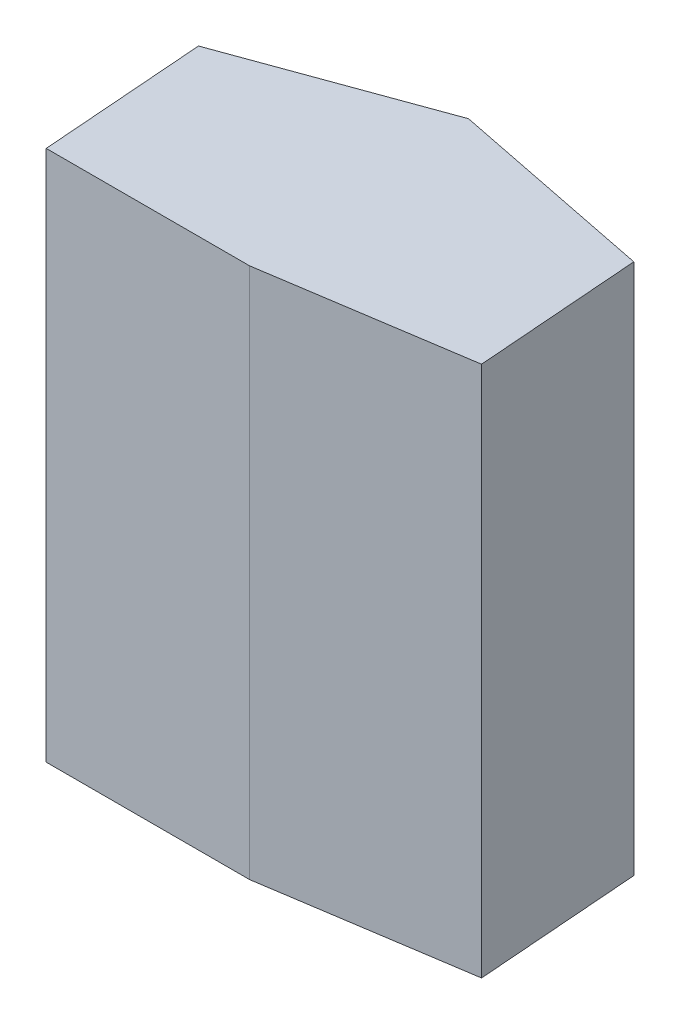
ISO-10303-21;
HEADER;
FILE_DESCRIPTION(('STEP AP214'),'2;1');
FILE_NAME('part.step','',(''),(''),'','','');
FILE_SCHEMA(('AUTOMOTIVE_DESIGN { 1 0 10303 214 1 1 1 1 }'));
ENDSEC;
DATA;
#1=APPLICATION_CONTEXT('core data for automotive mechanical design processes');
#2=APPLICATION_PROTOCOL_DEFINITION('international standard','automotive_design',2000,#1);
#3=PRODUCT_CONTEXT('',#1,'mechanical');
#4=PRODUCT('Part','Part','',(#3));
#5=PRODUCT_RELATED_PRODUCT_CATEGORY('part','',(#4));
#6=PRODUCT_DEFINITION_FORMATION('','',#4);
#7=PRODUCT_DEFINITION_CONTEXT('part definition',#1,'design');
#8=PRODUCT_DEFINITION('design','',#6,#7);
#9=PRODUCT_DEFINITION_SHAPE('','',#8);
#10=(LENGTH_UNIT() NAMED_UNIT(*) SI_UNIT(.MILLI.,.METRE.));
#11=(NAMED_UNIT(*) PLANE_ANGLE_UNIT() SI_UNIT($,.RADIAN.));
#12=(NAMED_UNIT(*) SI_UNIT($,.STERADIAN.) SOLID_ANGLE_UNIT());
#13=UNCERTAINTY_MEASURE_WITH_UNIT(LENGTH_MEASURE(1.E-05),#10,'distance_accuracy_value','');
#14=(GEOMETRIC_REPRESENTATION_CONTEXT(3) GLOBAL_UNCERTAINTY_ASSIGNED_CONTEXT((#13)) GLOBAL_UNIT_ASSIGNED_CONTEXT((#10,
#11,#12)) REPRESENTATION_CONTEXT('',''));
#15=CARTESIAN_POINT('',(0.,0.,0.));
#16=DIRECTION('',(0.,0.,1.));
#17=DIRECTION('',(1.,0.,0.));
#18=AXIS2_PLACEMENT_3D('',#15,#16,#17);
#19=CARTESIAN_POINT('',(11.380000052657,6.5,0.));
#20=DIRECTION('',(0.997122363601419,0.,-0.0758089177202688));
#21=DIRECTION('',(-0.0758089177202688,0.,-0.99712236360142));
#22=AXIS2_PLACEMENT_3D('',#19,#20,#21);
#23=PLANE('',#22);
#24=DIRECTION('',(0.0758089177202688,0.,0.99712236360142));
#25=VECTOR('',#24,1.);
#26=CARTESIAN_POINT('',(11.380000052657,-6.5,0.));
#27=LINE('',#26,#25);
#28=CARTESIAN_POINT('',(11.0735741143516,-6.5,-4.03045136456456));
#29=VERTEX_POINT('',#28);
#30=CARTESIAN_POINT('',(11.380000052657,-6.5,0.));
#31=VERTEX_POINT('',#30);
#32=EDGE_CURVE('E114',#29,#31,#27,.T.);
#33=ORIENTED_EDGE('',*,*,#32,.T.);
#34=DIRECTION('',(0.,-1.,0.));
#35=VECTOR('',#34,1.);
#36=CARTESIAN_POINT('',(11.380000052657,6.5,0.));
#37=LINE('',#36,#35);
#38=CARTESIAN_POINT('',(11.380000052657,6.5,0.));
#39=VERTEX_POINT('',#38);
#40=EDGE_CURVE('E11',#39,#31,#37,.T.);
#41=ORIENTED_EDGE('',*,*,#40,.F.);
#42=DIRECTION('',(0.0758089177202688,0.,0.99712236360142));
#43=VECTOR('',#42,1.);
#44=CARTESIAN_POINT('',(11.380000052657,6.5,0.));
#45=LINE('',#44,#43);
#46=CARTESIAN_POINT('',(11.0735741143516,6.5,-4.03045136456456));
#47=VERTEX_POINT('',#46);
#48=EDGE_CURVE('E131',#47,#39,#45,.T.);
#49=ORIENTED_EDGE('',*,*,#48,.F.);
#50=DIRECTION('',(0.,-1.,0.));
#51=VECTOR('',#50,1.);
#52=CARTESIAN_POINT('',(11.0735741143516,6.5,-4.03045136456456));
#53=LINE('',#52,#51);
#54=EDGE_CURVE('E47',#47,#29,#53,.T.);
#55=ORIENTED_EDGE('',*,*,#54,.T.);
#56=EDGE_LOOP('',(#33,#41,#49,#55));
#57=FACE_BOUND('',#56,.T.);
#58=ADVANCED_FACE('F39',(#57),#23,.F.);
#59=CARTESIAN_POINT('',(16.3556499539828,6.5,0.));
#60=DIRECTION('',(0.,0.,-1.));
#61=DIRECTION('',(-1.,0.,0.));
#62=AXIS2_PLACEMENT_3D('',#59,#60,#61);
#63=PLANE('',#62);
#64=DIRECTION('',(1.,0.,0.));
#65=VECTOR('',#64,1.);
#66=CARTESIAN_POINT('',(16.3556499539828,-6.5,0.));
#67=LINE('',#66,#65);
#68=CARTESIAN_POINT('',(16.3556499539828,-6.5,0.));
#69=VERTEX_POINT('',#68);
#70=EDGE_CURVE('E137',#31,#69,#67,.T.);
#71=ORIENTED_EDGE('',*,*,#70,.T.);
#72=DIRECTION('',(0.,-1.,0.));
#73=VECTOR('',#72,1.);
#74=CARTESIAN_POINT('',(16.3556499539828,6.5,0.));
#75=LINE('',#74,#73);
#76=CARTESIAN_POINT('',(16.3556499539828,6.5,0.));
#77=VERTEX_POINT('',#76);
#78=EDGE_CURVE('E115',#77,#69,#75,.T.);
#79=ORIENTED_EDGE('',*,*,#78,.F.);
#80=DIRECTION('',(1.,0.,0.));
#81=VECTOR('',#80,1.);
#82=CARTESIAN_POINT('',(16.3556499539828,6.5,0.));
#83=LINE('',#82,#81);
#84=EDGE_CURVE('E79',#39,#77,#83,.T.);
#85=ORIENTED_EDGE('',*,*,#84,.F.);
#86=ORIENTED_EDGE('',*,*,#40,.T.);
#87=EDGE_LOOP('',(#71,#79,#85,#86));
#88=FACE_BOUND('',#87,.T.);
#89=ADVANCED_FACE('F146',(#88),#63,.F.);
#90=CARTESIAN_POINT('',(11.0735741143516,6.5,-4.03045136456456));
#91=DIRECTION('',(0.342020143325657,0.,0.939692620785913));
#92=DIRECTION('',(0.939692620785913,0.,-0.342020143325657));
#93=AXIS2_PLACEMENT_3D('',#90,#91,#92);
#94=PLANE('',#93);
#95=DIRECTION('',(-0.939692620785913,0.,0.342020143325657));
#96=VECTOR('',#95,1.);
#97=CARTESIAN_POINT('',(11.0735741143516,-6.5,-4.03045136456456));
#98=LINE('',#97,#96);
#99=CARTESIAN_POINT('',(15.9150795598671,-6.5,-5.79261523576984));
#100=VERTEX_POINT('',#99);
#101=EDGE_CURVE('E72',#100,#29,#98,.T.);
#102=ORIENTED_EDGE('',*,*,#101,.T.);
#103=ORIENTED_EDGE('',*,*,#54,.F.);
#104=DIRECTION('',(-0.939692620785913,0.,0.342020143325657));
#105=VECTOR('',#104,1.);
#106=CARTESIAN_POINT('',(11.0735741143516,6.5,-4.03045136456456));
#107=LINE('',#106,#105);
#108=CARTESIAN_POINT('',(15.9150795598671,6.5,-5.79261523576984));
#109=VERTEX_POINT('',#108);
#110=EDGE_CURVE('E55',#109,#47,#107,.T.);
#111=ORIENTED_EDGE('',*,*,#110,.F.);
#112=DIRECTION('',(0.,-1.,0.));
#113=VECTOR('',#112,1.);
#114=CARTESIAN_POINT('',(15.9150795598671,6.5,-5.79261523576984));
#115=LINE('',#114,#113);
#116=EDGE_CURVE('E69',#109,#100,#115,.T.);
#117=ORIENTED_EDGE('',*,*,#116,.T.);
#118=EDGE_LOOP('',(#102,#103,#111,#117));
#119=FACE_BOUND('',#118,.T.);
#120=ADVANCED_FACE('F148',(#119),#94,.F.);
#121=CARTESIAN_POINT('',(0.,6.5,0.));
#122=DIRECTION('',(0.,1.,0.));
#123=DIRECTION('',(0.,0.,1.));
#124=AXIS2_PLACEMENT_3D('',#121,#122,#123);
#125=PLANE('',#124);
#126=ORIENTED_EDGE('',*,*,#48,.T.);
#127=ORIENTED_EDGE('',*,*,#84,.T.);
#128=DIRECTION('',(-0.988497129690804,0.,0.151239626398116));
#129=VECTOR('',#128,1.);
#130=CARTESIAN_POINT('',(16.3556499539828,6.5,0.));
#131=LINE('',#130,#129);
#132=CARTESIAN_POINT('',(21.2740655997897,6.5,-0.752515432164337));
#133=VERTEX_POINT('',#132);
#134=EDGE_CURVE('E96',#133,#77,#131,.T.);
#135=ORIENTED_EDGE('',*,*,#134,.F.);
#136=DIRECTION('',(0.0758675161728329,0.,0.997117906764173));
#137=VECTOR('',#136,1.);
#138=CARTESIAN_POINT('',(21.2740655997897,6.5,-0.752515432164337));
#139=LINE('',#138,#137);
#140=CARTESIAN_POINT('',(20.9674028016748,6.5,-4.78294878182278));
#141=VERTEX_POINT('',#140);
#142=EDGE_CURVE('E100',#141,#133,#139,.T.);
#143=ORIENTED_EDGE('',*,*,#142,.F.);
#144=DIRECTION('',(0.980610457135706,0.,0.195967169077121));
#145=VECTOR('',#144,1.);
#146=CARTESIAN_POINT('',(20.9674028016748,6.5,-4.78294878182278));
#147=LINE('',#146,#145);
#148=EDGE_CURVE('E104',#109,#141,#147,.T.);
#149=ORIENTED_EDGE('',*,*,#148,.F.);
#150=ORIENTED_EDGE('',*,*,#110,.T.);
#151=EDGE_LOOP('',(#126,#127,#135,#143,#149,#150));
#152=FACE_BOUND('',#151,.T.);
#153=ADVANCED_FACE('F98',(#152),#125,.T.);
#154=CARTESIAN_POINT('',(0.,-6.5,0.));
#155=DIRECTION('',(0.,1.,0.));
#156=DIRECTION('',(0.,0.,1.));
#157=AXIS2_PLACEMENT_3D('',#154,#155,#156);
#158=PLANE('',#157);
#159=ORIENTED_EDGE('',*,*,#32,.F.);
#160=ORIENTED_EDGE('',*,*,#101,.F.);
#161=DIRECTION('',(0.980610457135706,0.,0.195967169077121));
#162=VECTOR('',#161,1.);
#163=CARTESIAN_POINT('',(20.9674028016748,-6.5,-4.78294878182278));
#164=LINE('',#163,#162);
#165=CARTESIAN_POINT('',(20.9674028016748,-6.5,-4.78294878182278));
#166=VERTEX_POINT('',#165);
#167=EDGE_CURVE('E120',#100,#166,#164,.T.);
#168=ORIENTED_EDGE('',*,*,#167,.T.);
#169=DIRECTION('',(0.0758675161728329,0.,0.997117906764173));
#170=VECTOR('',#169,1.);
#171=CARTESIAN_POINT('',(21.2740655997897,-6.5,-0.752515432164337));
#172=LINE('',#171,#170);
#173=CARTESIAN_POINT('',(21.2740655997897,-6.5,-0.752515432164337));
#174=VERTEX_POINT('',#173);
#175=EDGE_CURVE('E125',#166,#174,#172,.T.);
#176=ORIENTED_EDGE('',*,*,#175,.T.);
#177=DIRECTION('',(-0.988497129690804,0.,0.151239626398116));
#178=VECTOR('',#177,1.);
#179=CARTESIAN_POINT('',(16.3556499539828,-6.5,0.));
#180=LINE('',#179,#178);
#181=EDGE_CURVE('E110',#174,#69,#180,.T.);
#182=ORIENTED_EDGE('',*,*,#181,.T.);
#183=ORIENTED_EDGE('',*,*,#70,.F.);
#184=EDGE_LOOP('',(#159,#160,#168,#176,#182,#183));
#185=FACE_BOUND('',#184,.T.);
#186=ADVANCED_FACE('F144',(#185),#158,.F.);
#187=CARTESIAN_POINT('',(21.2740655997897,6.5,-0.752515432164337));
#188=DIRECTION('',(-0.997117906764172,0.,0.0758675161728329));
#189=DIRECTION('',(-0.075867516172833,0.,-0.997117906764173));
#190=AXIS2_PLACEMENT_3D('',#187,#188,#189);
#191=PLANE('',#190);
#192=ORIENTED_EDGE('',*,*,#175,.F.);
#193=DIRECTION('',(0.,-1.,0.));
#194=VECTOR('',#193,1.);
#195=CARTESIAN_POINT('',(20.9674028016748,6.5,-4.78294878182278));
#196=LINE('',#195,#194);
#197=EDGE_CURVE('E119',#141,#166,#196,.T.);
#198=ORIENTED_EDGE('',*,*,#197,.F.);
#199=ORIENTED_EDGE('',*,*,#142,.T.);
#200=DIRECTION('',(0.,-1.,0.));
#201=VECTOR('',#200,1.);
#202=CARTESIAN_POINT('',(21.2740655997897,6.5,-0.752515432164337));
#203=LINE('',#202,#201);
#204=EDGE_CURVE('E107',#133,#174,#203,.T.);
#205=ORIENTED_EDGE('',*,*,#204,.T.);
#206=EDGE_LOOP('',(#192,#198,#199,#205));
#207=FACE_BOUND('',#206,.T.);
#208=ADVANCED_FACE('F117',(#207),#191,.F.);
#209=CARTESIAN_POINT('',(16.3556499539828,6.5,0.));
#210=DIRECTION('',(-0.151239626398116,0.,-0.988497129690804));
#211=DIRECTION('',(0.988497129690804,0.,-0.151239626398116));
#212=AXIS2_PLACEMENT_3D('',#209,#210,#211);
#213=PLANE('',#212);
#214=ORIENTED_EDGE('',*,*,#181,.F.);
#215=ORIENTED_EDGE('',*,*,#204,.F.);
#216=ORIENTED_EDGE('',*,*,#134,.T.);
#217=ORIENTED_EDGE('',*,*,#78,.T.);
#218=EDGE_LOOP('',(#214,#215,#216,#217));
#219=FACE_BOUND('',#218,.T.);
#220=ADVANCED_FACE('F108',(#219),#213,.F.);
#221=CARTESIAN_POINT('',(20.9674028016748,6.5,-4.78294878182278));
#222=DIRECTION('',(-0.195967169077121,0.,0.980610457135707));
#223=DIRECTION('',(-0.980610457135706,0.,-0.195967169077121));
#224=AXIS2_PLACEMENT_3D('',#221,#222,#223);
#225=PLANE('',#224);
#226=ORIENTED_EDGE('',*,*,#167,.F.);
#227=ORIENTED_EDGE('',*,*,#116,.F.);
#228=ORIENTED_EDGE('',*,*,#148,.T.);
#229=ORIENTED_EDGE('',*,*,#197,.T.);
#230=EDGE_LOOP('',(#226,#227,#228,#229));
#231=FACE_BOUND('',#230,.T.);
#232=ADVANCED_FACE('F164',(#231),#225,.F.);
#233=CLOSED_SHELL('',(#58,#89,#120,#153,#186,#208,#220,#232));
#234=MANIFOLD_SOLID_BREP('B2',#233);
#235=ADVANCED_BREP_SHAPE_REPRESENTATION('',(#18,#234),#14);
#236=SHAPE_DEFINITION_REPRESENTATION(#9,#235);
ENDSEC;
END-ISO-10303-21;
